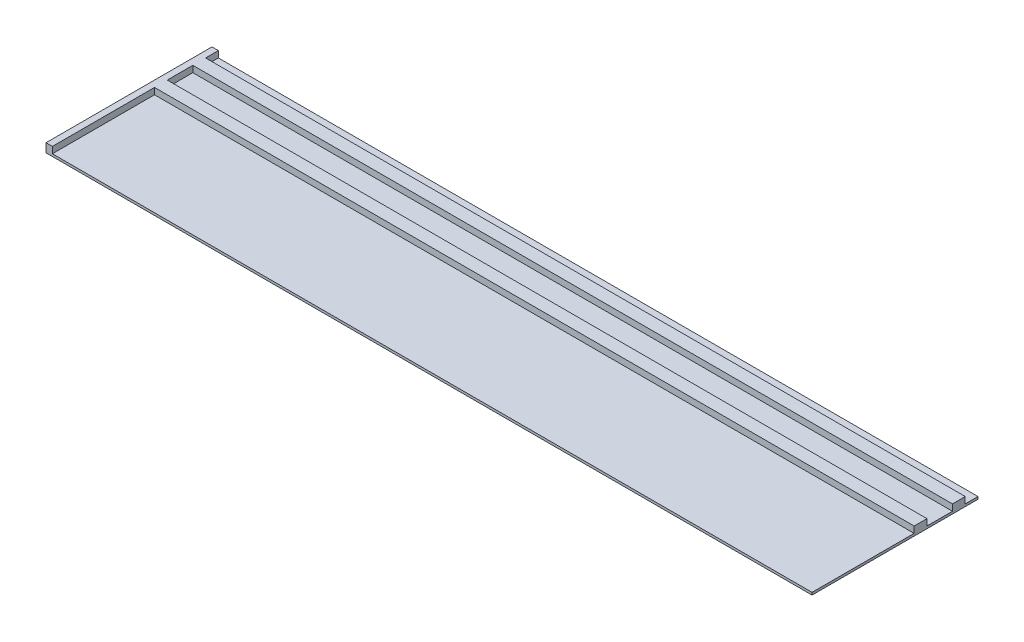
ISO-10303-21;
HEADER;
FILE_DESCRIPTION(('STEP AP214'),'2;1');
FILE_NAME('part.step','',(''),(''),'','','');
FILE_SCHEMA(('AUTOMOTIVE_DESIGN { 1 0 10303 214 1 1 1 1 }'));
ENDSEC;
DATA;
#1=APPLICATION_CONTEXT('core data for automotive mechanical design processes');
#2=APPLICATION_PROTOCOL_DEFINITION('international standard','automotive_design',2000,#1);
#3=PRODUCT_CONTEXT('',#1,'mechanical');
#4=PRODUCT('Part','Part','',(#3));
#5=PRODUCT_RELATED_PRODUCT_CATEGORY('part','',(#4));
#6=PRODUCT_DEFINITION_FORMATION('','',#4);
#7=PRODUCT_DEFINITION_CONTEXT('part definition',#1,'design');
#8=PRODUCT_DEFINITION('design','',#6,#7);
#9=PRODUCT_DEFINITION_SHAPE('','',#8);
#10=(LENGTH_UNIT() NAMED_UNIT(*) SI_UNIT(.MILLI.,.METRE.));
#11=(NAMED_UNIT(*) PLANE_ANGLE_UNIT() SI_UNIT($,.RADIAN.));
#12=(NAMED_UNIT(*) SI_UNIT($,.STERADIAN.) SOLID_ANGLE_UNIT());
#13=UNCERTAINTY_MEASURE_WITH_UNIT(LENGTH_MEASURE(1.E-05),#10,'distance_accuracy_value','');
#14=(GEOMETRIC_REPRESENTATION_CONTEXT(3) GLOBAL_UNCERTAINTY_ASSIGNED_CONTEXT((#13)) GLOBAL_UNIT_ASSIGNED_CONTEXT((#10,
#11,#12)) REPRESENTATION_CONTEXT('',''));
#15=CARTESIAN_POINT('',(0.,0.,0.));
#16=DIRECTION('',(0.,0.,1.));
#17=DIRECTION('',(1.,0.,0.));
#18=AXIS2_PLACEMENT_3D('',#15,#16,#17);
#19=CARTESIAN_POINT('',(0.,2.38125,0.));
#20=DIRECTION('',(0.,-1.,0.));
#21=DIRECTION('',(0.,0.,-1.));
#22=AXIS2_PLACEMENT_3D('',#19,#20,#21);
#23=PLANE('',#22);
#24=DIRECTION('',(0.,0.,-1.));
#25=VECTOR('',#24,1.);
#26=CARTESIAN_POINT('',(-374.65,2.38125,-82.55));
#27=LINE('',#26,#25);
#28=CARTESIAN_POINT('',(-374.65,2.38125,82.55));
#29=VERTEX_POINT('',#28);
#30=CARTESIAN_POINT('',(-374.65,2.38125,-19.05));
#31=VERTEX_POINT('',#30);
#32=EDGE_CURVE('E161',#29,#31,#27,.T.);
#33=ORIENTED_EDGE('',*,*,#32,.F.);
#34=DIRECTION('',(1.,0.,0.));
#35=VECTOR('',#34,1.);
#36=CARTESIAN_POINT('',(-381.,2.38125,82.55));
#37=LINE('',#36,#35);
#38=CARTESIAN_POINT('',(381.,2.38125,82.55));
#39=VERTEX_POINT('',#38);
#40=EDGE_CURVE('E239',#29,#39,#37,.T.);
#41=ORIENTED_EDGE('',*,*,#40,.T.);
#42=DIRECTION('',(0.,0.,-1.));
#43=VECTOR('',#42,1.);
#44=CARTESIAN_POINT('',(381.,2.38125,82.55));
#45=LINE('',#44,#43);
#46=CARTESIAN_POINT('',(381.,2.38125,-19.05));
#47=VERTEX_POINT('',#46);
#48=EDGE_CURVE('E231',#39,#47,#45,.T.);
#49=ORIENTED_EDGE('',*,*,#48,.T.);
#50=DIRECTION('',(1.,0.,0.));
#51=VECTOR('',#50,1.);
#52=CARTESIAN_POINT('',(-381.,2.38125,-19.05));
#53=LINE('',#52,#51);
#54=EDGE_CURVE('E37',#31,#47,#53,.T.);
#55=ORIENTED_EDGE('',*,*,#54,.F.);
#56=EDGE_LOOP('',(#33,#41,#49,#55));
#57=FACE_BOUND('',#56,.T.);
#58=ADVANCED_FACE('F33',(#57),#23,.F.);
#59=CARTESIAN_POINT('',(-374.65,2.38125,-69.85));
#60=VERTEX_POINT('',#59);
#61=CARTESIAN_POINT('',(-374.65,2.38125,-82.55));
#62=VERTEX_POINT('',#61);
#63=EDGE_CURVE('E165',#60,#62,#27,.T.);
#64=ORIENTED_EDGE('',*,*,#63,.F.);
#65=DIRECTION('',(-1.,0.,0.));
#66=VECTOR('',#65,1.);
#67=CARTESIAN_POINT('',(-381.,2.38125,-69.85));
#68=LINE('',#67,#66);
#69=CARTESIAN_POINT('',(381.,2.38125,-69.85));
#70=VERTEX_POINT('',#69);
#71=EDGE_CURVE('E195',#70,#60,#68,.T.);
#72=ORIENTED_EDGE('',*,*,#71,.F.);
#73=CARTESIAN_POINT('',(381.,2.38125,-82.55));
#74=VERTEX_POINT('',#73);
#75=EDGE_CURVE('E213',#70,#74,#45,.T.);
#76=ORIENTED_EDGE('',*,*,#75,.T.);
#77=DIRECTION('',(-1.,0.,0.));
#78=VECTOR('',#77,1.);
#79=CARTESIAN_POINT('',(-381.,2.38125,-82.55));
#80=LINE('',#79,#78);
#81=EDGE_CURVE('E241',#74,#62,#80,.T.);
#82=ORIENTED_EDGE('',*,*,#81,.T.);
#83=EDGE_LOOP('',(#64,#72,#76,#82));
#84=FACE_BOUND('',#83,.T.);
#85=ADVANCED_FACE('F277',(#84),#23,.F.);
#86=CARTESIAN_POINT('',(-381.,8.73125,-69.85));
#87=DIRECTION('',(0.,0.,1.));
#88=DIRECTION('',(1.,0.,0.));
#89=AXIS2_PLACEMENT_3D('',#86,#87,#88);
#90=PLANE('',#89);
#91=DIRECTION('',(0.,-1.,0.));
#92=VECTOR('',#91,1.);
#93=CARTESIAN_POINT('',(-374.65,8.73125,-69.85));
#94=LINE('',#93,#92);
#95=CARTESIAN_POINT('',(-374.65,8.73125,-69.85));
#96=VERTEX_POINT('',#95);
#97=EDGE_CURVE('E178',#96,#60,#94,.T.);
#98=ORIENTED_EDGE('',*,*,#97,.F.);
#99=DIRECTION('',(-1.,0.,0.));
#100=VECTOR('',#99,1.);
#101=CARTESIAN_POINT('',(-381.,8.73125,-69.85));
#102=LINE('',#101,#100);
#103=CARTESIAN_POINT('',(381.,8.73125,-69.85));
#104=VERTEX_POINT('',#103);
#105=EDGE_CURVE('E155',#104,#96,#102,.T.);
#106=ORIENTED_EDGE('',*,*,#105,.F.);
#107=DIRECTION('',(0.,-1.,0.));
#108=VECTOR('',#107,1.);
#109=CARTESIAN_POINT('',(381.,8.73125,-69.85));
#110=LINE('',#109,#108);
#111=EDGE_CURVE('E215',#104,#70,#110,.T.);
#112=ORIENTED_EDGE('',*,*,#111,.T.);
#113=ORIENTED_EDGE('',*,*,#71,.T.);
#114=EDGE_LOOP('',(#98,#106,#112,#113));
#115=FACE_BOUND('',#114,.T.);
#116=ADVANCED_FACE('F281',(#115),#90,.F.);
#117=CARTESIAN_POINT('',(-381.,8.73125,-19.05));
#118=DIRECTION('',(0.,0.,-1.));
#119=DIRECTION('',(-1.,0.,0.));
#120=AXIS2_PLACEMENT_3D('',#117,#118,#119);
#121=PLANE('',#120);
#122=DIRECTION('',(0.,1.,0.));
#123=VECTOR('',#122,1.);
#124=CARTESIAN_POINT('',(-374.65,8.73125,-19.05));
#125=LINE('',#124,#123);
#126=CARTESIAN_POINT('',(-374.65,8.73125,-19.05));
#127=VERTEX_POINT('',#126);
#128=EDGE_CURVE('E176',#31,#127,#125,.T.);
#129=ORIENTED_EDGE('',*,*,#128,.F.);
#130=ORIENTED_EDGE('',*,*,#54,.T.);
#131=DIRECTION('',(0.,-1.,0.));
#132=VECTOR('',#131,1.);
#133=CARTESIAN_POINT('',(381.,8.73125,-19.05));
#134=LINE('',#133,#132);
#135=CARTESIAN_POINT('',(381.,8.73125,-19.05));
#136=VERTEX_POINT('',#135);
#137=EDGE_CURVE('E205',#136,#47,#134,.T.);
#138=ORIENTED_EDGE('',*,*,#137,.F.);
#139=DIRECTION('',(1.,0.,0.));
#140=VECTOR('',#139,1.);
#141=CARTESIAN_POINT('',(-381.,8.73125,-19.05));
#142=LINE('',#141,#140);
#143=EDGE_CURVE('E154',#127,#136,#142,.T.);
#144=ORIENTED_EDGE('',*,*,#143,.F.);
#145=EDGE_LOOP('',(#129,#130,#138,#144));
#146=FACE_BOUND('',#145,.T.);
#147=ADVANCED_FACE('F235',(#146),#121,.F.);
#148=CARTESIAN_POINT('',(-381.,2.38125,-57.15));
#149=DIRECTION('',(0.,0.,-1.));
#150=DIRECTION('',(-1.,0.,0.));
#151=AXIS2_PLACEMENT_3D('',#148,#149,#150);
#152=PLANE('',#151);
#153=DIRECTION('',(0.,1.,0.));
#154=VECTOR('',#153,1.);
#155=CARTESIAN_POINT('',(-374.65,2.38125,-57.15));
#156=LINE('',#155,#154);
#157=CARTESIAN_POINT('',(-374.65,2.38125,-57.15));
#158=VERTEX_POINT('',#157);
#159=CARTESIAN_POINT('',(-374.65,8.73125,-57.15));
#160=VERTEX_POINT('',#159);
#161=EDGE_CURVE('E174',#158,#160,#156,.T.);
#162=ORIENTED_EDGE('',*,*,#161,.F.);
#163=DIRECTION('',(-1.,0.,0.));
#164=VECTOR('',#163,1.);
#165=CARTESIAN_POINT('',(-381.,2.38125,-57.15));
#166=LINE('',#165,#164);
#167=CARTESIAN_POINT('',(381.,2.38125,-57.15));
#168=VERTEX_POINT('',#167);
#169=EDGE_CURVE('E186',#168,#158,#166,.T.);
#170=ORIENTED_EDGE('',*,*,#169,.F.);
#171=DIRECTION('',(0.,1.,0.));
#172=VECTOR('',#171,1.);
#173=CARTESIAN_POINT('',(381.,2.38125,-57.15));
#174=LINE('',#173,#172);
#175=CARTESIAN_POINT('',(381.,8.73125,-57.15));
#176=VERTEX_POINT('',#175);
#177=EDGE_CURVE('E193',#168,#176,#174,.T.);
#178=ORIENTED_EDGE('',*,*,#177,.T.);
#179=DIRECTION('',(-1.,0.,0.));
#180=VECTOR('',#179,1.);
#181=CARTESIAN_POINT('',(-381.,8.73125,-57.15));
#182=LINE('',#181,#180);
#183=EDGE_CURVE('E184',#176,#160,#182,.T.);
#184=ORIENTED_EDGE('',*,*,#183,.T.);
#185=EDGE_LOOP('',(#162,#170,#178,#184));
#186=FACE_BOUND('',#185,.T.);
#187=ADVANCED_FACE('F288',(#186),#152,.F.);
#188=CARTESIAN_POINT('',(-381.,2.38125,-31.75));
#189=DIRECTION('',(0.,0.,1.));
#190=DIRECTION('',(1.,0.,0.));
#191=AXIS2_PLACEMENT_3D('',#188,#189,#190);
#192=PLANE('',#191);
#193=DIRECTION('',(0.,-1.,0.));
#194=VECTOR('',#193,1.);
#195=CARTESIAN_POINT('',(-374.65,2.38125,-31.75));
#196=LINE('',#195,#194);
#197=CARTESIAN_POINT('',(-374.65,8.73125,-31.75));
#198=VERTEX_POINT('',#197);
#199=CARTESIAN_POINT('',(-374.65,2.38125,-31.75));
#200=VERTEX_POINT('',#199);
#201=EDGE_CURVE('E58',#198,#200,#196,.T.);
#202=ORIENTED_EDGE('',*,*,#201,.F.);
#203=DIRECTION('',(1.,0.,0.));
#204=VECTOR('',#203,1.);
#205=CARTESIAN_POINT('',(-381.,8.73125,-31.75));
#206=LINE('',#205,#204);
#207=CARTESIAN_POINT('',(381.,8.73125,-31.75));
#208=VERTEX_POINT('',#207);
#209=EDGE_CURVE('E180',#198,#208,#206,.T.);
#210=ORIENTED_EDGE('',*,*,#209,.T.);
#211=DIRECTION('',(0.,1.,0.));
#212=VECTOR('',#211,1.);
#213=CARTESIAN_POINT('',(381.,2.38125,-31.75));
#214=LINE('',#213,#212);
#215=CARTESIAN_POINT('',(381.,2.38125,-31.75));
#216=VERTEX_POINT('',#215);
#217=EDGE_CURVE('E189',#216,#208,#214,.T.);
#218=ORIENTED_EDGE('',*,*,#217,.F.);
#219=DIRECTION('',(1.,0.,0.));
#220=VECTOR('',#219,1.);
#221=CARTESIAN_POINT('',(-381.,2.38125,-31.75));
#222=LINE('',#221,#220);
#223=EDGE_CURVE('E181',#200,#216,#222,.T.);
#224=ORIENTED_EDGE('',*,*,#223,.F.);
#225=EDGE_LOOP('',(#202,#210,#218,#224));
#226=FACE_BOUND('',#225,.T.);
#227=ADVANCED_FACE('F290',(#226),#192,.F.);
#228=CARTESIAN_POINT('',(0.,2.38125,0.));
#229=DIRECTION('',(0.,1.,0.));
#230=DIRECTION('',(0.,0.,1.));
#231=AXIS2_PLACEMENT_3D('',#228,#229,#230);
#232=PLANE('',#231);
#233=ORIENTED_EDGE('',*,*,#169,.T.);
#234=DIRECTION('',(0.,0.,1.));
#235=VECTOR('',#234,1.);
#236=CARTESIAN_POINT('',(-374.65,2.38125,0.));
#237=LINE('',#236,#235);
#238=EDGE_CURVE('E11',#158,#200,#237,.T.);
#239=ORIENTED_EDGE('',*,*,#238,.T.);
#240=ORIENTED_EDGE('',*,*,#223,.T.);
#241=DIRECTION('',(0.,0.,-1.));
#242=VECTOR('',#241,1.);
#243=CARTESIAN_POINT('',(381.,2.38125,-57.15));
#244=LINE('',#243,#242);
#245=EDGE_CURVE('E183',#216,#168,#244,.T.);
#246=ORIENTED_EDGE('',*,*,#245,.T.);
#247=EDGE_LOOP('',(#233,#239,#240,#246));
#248=FACE_BOUND('',#247,.T.);
#249=ADVANCED_FACE('F293',(#248),#232,.T.);
#250=CARTESIAN_POINT('',(381.,2.38125,82.55));
#251=DIRECTION('',(-1.,0.,0.));
#252=DIRECTION('',(0.,0.,1.));
#253=AXIS2_PLACEMENT_3D('',#250,#251,#252);
#254=PLANE('',#253);
#255=DIRECTION('',(0.,0.,-1.));
#256=VECTOR('',#255,1.);
#257=CARTESIAN_POINT('',(381.,8.73125,-19.05));
#258=LINE('',#257,#256);
#259=EDGE_CURVE('E201',#176,#104,#258,.T.);
#260=ORIENTED_EDGE('',*,*,#259,.F.);
#261=ORIENTED_EDGE('',*,*,#177,.F.);
#262=ORIENTED_EDGE('',*,*,#245,.F.);
#263=ORIENTED_EDGE('',*,*,#217,.T.);
#264=EDGE_CURVE('E198',#136,#208,#258,.T.);
#265=ORIENTED_EDGE('',*,*,#264,.F.);
#266=ORIENTED_EDGE('',*,*,#137,.T.);
#267=ORIENTED_EDGE('',*,*,#48,.F.);
#268=DIRECTION('',(0.,-1.,0.));
#269=VECTOR('',#268,1.);
#270=CARTESIAN_POINT('',(381.,2.38125,82.55));
#271=LINE('',#270,#269);
#272=CARTESIAN_POINT('',(381.,0.,82.55));
#273=VERTEX_POINT('',#272);
#274=EDGE_CURVE('E147',#39,#273,#271,.T.);
#275=ORIENTED_EDGE('',*,*,#274,.T.);
#276=DIRECTION('',(0.,0.,-1.));
#277=VECTOR('',#276,1.);
#278=CARTESIAN_POINT('',(381.,0.,82.55));
#279=LINE('',#278,#277);
#280=CARTESIAN_POINT('',(381.,0.,-82.55));
#281=VERTEX_POINT('',#280);
#282=EDGE_CURVE('E218',#273,#281,#279,.T.);
#283=ORIENTED_EDGE('',*,*,#282,.T.);
#284=DIRECTION('',(0.,-1.,0.));
#285=VECTOR('',#284,1.);
#286=CARTESIAN_POINT('',(381.,2.38125,-82.55));
#287=LINE('',#286,#285);
#288=EDGE_CURVE('E43',#74,#281,#287,.T.);
#289=ORIENTED_EDGE('',*,*,#288,.F.);
#290=ORIENTED_EDGE('',*,*,#75,.F.);
#291=ORIENTED_EDGE('',*,*,#111,.F.);
#292=EDGE_LOOP('',(#260,#261,#262,#263,#265,#266,#267,#275,#283,#289,#290,#291));
#293=FACE_BOUND('',#292,.T.);
#294=ADVANCED_FACE('F35',(#293),#254,.F.);
#295=CARTESIAN_POINT('',(-381.,2.38125,-82.55));
#296=DIRECTION('',(0.,0.,1.));
#297=DIRECTION('',(1.,0.,0.));
#298=AXIS2_PLACEMENT_3D('',#295,#296,#297);
#299=PLANE('',#298);
#300=DIRECTION('',(-1.,0.,0.));
#301=VECTOR('',#300,1.);
#302=CARTESIAN_POINT('',(-381.,0.,-82.55));
#303=LINE('',#302,#301);
#304=CARTESIAN_POINT('',(-381.,0.,-82.55));
#305=VERTEX_POINT('',#304);
#306=EDGE_CURVE('E253',#281,#305,#303,.T.);
#307=ORIENTED_EDGE('',*,*,#306,.T.);
#308=DIRECTION('',(0.,-1.,0.));
#309=VECTOR('',#308,1.);
#310=CARTESIAN_POINT('',(-381.,2.38125,-82.55));
#311=LINE('',#310,#309);
#312=CARTESIAN_POINT('',(-381.,8.73125,-82.55));
#313=VERTEX_POINT('',#312);
#314=EDGE_CURVE('E146',#313,#305,#311,.T.);
#315=ORIENTED_EDGE('',*,*,#314,.F.);
#316=DIRECTION('',(-1.,0.,0.));
#317=VECTOR('',#316,1.);
#318=CARTESIAN_POINT('',(-381.,8.73125,-82.55));
#319=LINE('',#318,#317);
#320=CARTESIAN_POINT('',(-374.65,8.73125,-82.55));
#321=VERTEX_POINT('',#320);
#322=EDGE_CURVE('E153',#321,#313,#319,.T.);
#323=ORIENTED_EDGE('',*,*,#322,.F.);
#324=DIRECTION('',(0.,-1.,0.));
#325=VECTOR('',#324,1.);
#326=CARTESIAN_POINT('',(-374.65,8.73125,-82.55));
#327=LINE('',#326,#325);
#328=EDGE_CURVE('E168',#321,#62,#327,.T.);
#329=ORIENTED_EDGE('',*,*,#328,.T.);
#330=ORIENTED_EDGE('',*,*,#81,.F.);
#331=ORIENTED_EDGE('',*,*,#288,.T.);
#332=EDGE_LOOP('',(#307,#315,#323,#329,#330,#331));
#333=FACE_BOUND('',#332,.T.);
#334=ADVANCED_FACE('F261',(#333),#299,.F.);
#335=CARTESIAN_POINT('',(-381.,2.38125,82.55));
#336=DIRECTION('',(1.,0.,0.));
#337=DIRECTION('',(0.,0.,-1.));
#338=AXIS2_PLACEMENT_3D('',#335,#336,#337);
#339=PLANE('',#338);
#340=DIRECTION('',(0.,-1.,0.));
#341=VECTOR('',#340,1.);
#342=CARTESIAN_POINT('',(-381.,2.38125,82.55));
#343=LINE('',#342,#341);
#344=CARTESIAN_POINT('',(-381.,8.73125,82.55));
#345=VERTEX_POINT('',#344);
#346=CARTESIAN_POINT('',(-381.,0.,82.55));
#347=VERTEX_POINT('',#346);
#348=EDGE_CURVE('E135',#345,#347,#343,.T.);
#349=ORIENTED_EDGE('',*,*,#348,.F.);
#350=DIRECTION('',(0.,0.,1.));
#351=VECTOR('',#350,1.);
#352=CARTESIAN_POINT('',(-381.,8.73125,-19.05));
#353=LINE('',#352,#351);
#354=EDGE_CURVE('E139',#313,#345,#353,.T.);
#355=ORIENTED_EDGE('',*,*,#354,.F.);
#356=ORIENTED_EDGE('',*,*,#314,.T.);
#357=DIRECTION('',(0.,0.,1.));
#358=VECTOR('',#357,1.);
#359=CARTESIAN_POINT('',(-381.,0.,82.55));
#360=LINE('',#359,#358);
#361=EDGE_CURVE('E142',#305,#347,#360,.T.);
#362=ORIENTED_EDGE('',*,*,#361,.T.);
#363=EDGE_LOOP('',(#349,#355,#356,#362));
#364=FACE_BOUND('',#363,.T.);
#365=ADVANCED_FACE('F137',(#364),#339,.F.);
#366=CARTESIAN_POINT('',(-381.,2.38125,82.55));
#367=DIRECTION('',(0.,0.,-1.));
#368=DIRECTION('',(-1.,0.,0.));
#369=AXIS2_PLACEMENT_3D('',#366,#367,#368);
#370=PLANE('',#369);
#371=DIRECTION('',(1.,0.,0.));
#372=VECTOR('',#371,1.);
#373=CARTESIAN_POINT('',(-381.,0.,82.55));
#374=LINE('',#373,#372);
#375=EDGE_CURVE('E244',#347,#273,#374,.T.);
#376=ORIENTED_EDGE('',*,*,#375,.T.);
#377=ORIENTED_EDGE('',*,*,#274,.F.);
#378=ORIENTED_EDGE('',*,*,#40,.F.);
#379=DIRECTION('',(0.,-1.,0.));
#380=VECTOR('',#379,1.);
#381=CARTESIAN_POINT('',(-374.65,8.73125,82.55));
#382=LINE('',#381,#380);
#383=CARTESIAN_POINT('',(-374.65,8.73125,82.55));
#384=VERTEX_POINT('',#383);
#385=EDGE_CURVE('E159',#384,#29,#382,.T.);
#386=ORIENTED_EDGE('',*,*,#385,.F.);
#387=DIRECTION('',(1.,0.,0.));
#388=VECTOR('',#387,1.);
#389=CARTESIAN_POINT('',(-381.,8.73125,82.55));
#390=LINE('',#389,#388);
#391=EDGE_CURVE('E150',#345,#384,#390,.T.);
#392=ORIENTED_EDGE('',*,*,#391,.F.);
#393=ORIENTED_EDGE('',*,*,#348,.T.);
#394=EDGE_LOOP('',(#376,#377,#378,#386,#392,#393));
#395=FACE_BOUND('',#394,.T.);
#396=ADVANCED_FACE('F157',(#395),#370,.F.);
#397=CARTESIAN_POINT('',(0.,0.,0.));
#398=DIRECTION('',(0.,-1.,0.));
#399=DIRECTION('',(0.,0.,-1.));
#400=AXIS2_PLACEMENT_3D('',#397,#398,#399);
#401=PLANE('',#400);
#402=ORIENTED_EDGE('',*,*,#282,.F.);
#403=ORIENTED_EDGE('',*,*,#375,.F.);
#404=ORIENTED_EDGE('',*,*,#361,.F.);
#405=ORIENTED_EDGE('',*,*,#306,.F.);
#406=EDGE_LOOP('',(#402,#403,#404,#405));
#407=FACE_BOUND('',#406,.T.);
#408=ADVANCED_FACE('F265',(#407),#401,.T.);
#409=CARTESIAN_POINT('',(0.,8.73125,0.));
#410=DIRECTION('',(0.,-1.,0.));
#411=DIRECTION('',(0.,0.,-1.));
#412=AXIS2_PLACEMENT_3D('',#409,#410,#411);
#413=PLANE('',#412);
#414=ORIENTED_EDGE('',*,*,#354,.T.);
#415=ORIENTED_EDGE('',*,*,#391,.T.);
#416=DIRECTION('',(0.,0.,-1.));
#417=VECTOR('',#416,1.);
#418=CARTESIAN_POINT('',(-374.65,8.73125,-82.55));
#419=LINE('',#418,#417);
#420=EDGE_CURVE('E50',#384,#127,#419,.T.);
#421=ORIENTED_EDGE('',*,*,#420,.T.);
#422=ORIENTED_EDGE('',*,*,#143,.T.);
#423=ORIENTED_EDGE('',*,*,#264,.T.);
#424=ORIENTED_EDGE('',*,*,#209,.F.);
#425=EDGE_CURVE('E163',#198,#160,#419,.T.);
#426=ORIENTED_EDGE('',*,*,#425,.T.);
#427=ORIENTED_EDGE('',*,*,#183,.F.);
#428=ORIENTED_EDGE('',*,*,#259,.T.);
#429=ORIENTED_EDGE('',*,*,#105,.T.);
#430=EDGE_CURVE('E160',#96,#321,#419,.T.);
#431=ORIENTED_EDGE('',*,*,#430,.T.);
#432=ORIENTED_EDGE('',*,*,#322,.T.);
#433=EDGE_LOOP('',(#414,#415,#421,#422,#423,#424,#426,#427,#428,#429,#431,#432));
#434=FACE_BOUND('',#433,.T.);
#435=ADVANCED_FACE('F149',(#434),#413,.F.);
#436=CARTESIAN_POINT('',(-374.65,8.73125,-82.55));
#437=DIRECTION('',(-1.,0.,0.));
#438=DIRECTION('',(0.,0.,1.));
#439=AXIS2_PLACEMENT_3D('',#436,#437,#438);
#440=PLANE('',#439);
#441=ORIENTED_EDGE('',*,*,#238,.F.);
#442=ORIENTED_EDGE('',*,*,#161,.T.);
#443=ORIENTED_EDGE('',*,*,#425,.F.);
#444=ORIENTED_EDGE('',*,*,#201,.T.);
#445=EDGE_LOOP('',(#441,#442,#443,#444));
#446=FACE_BOUND('',#445,.T.);
#447=ADVANCED_FACE('F272',(#446),#440,.F.);
#448=ORIENTED_EDGE('',*,*,#32,.T.);
#449=ORIENTED_EDGE('',*,*,#128,.T.);
#450=ORIENTED_EDGE('',*,*,#420,.F.);
#451=ORIENTED_EDGE('',*,*,#385,.T.);
#452=EDGE_LOOP('',(#448,#449,#450,#451));
#453=FACE_BOUND('',#452,.T.);
#454=ADVANCED_FACE('F303',(#453),#440,.F.);
#455=ORIENTED_EDGE('',*,*,#430,.F.);
#456=ORIENTED_EDGE('',*,*,#97,.T.);
#457=ORIENTED_EDGE('',*,*,#63,.T.);
#458=ORIENTED_EDGE('',*,*,#328,.F.);
#459=EDGE_LOOP('',(#455,#456,#457,#458));
#460=FACE_BOUND('',#459,.T.);
#461=ADVANCED_FACE('F301',(#460),#440,.F.);
#462=CLOSED_SHELL('',(#58,#85,#116,#147,#187,#227,#249,#294,#334,#365,#396,#408,#435,#447,#454,#461));
#463=MANIFOLD_SOLID_BREP('B2',#462);
#464=ADVANCED_BREP_SHAPE_REPRESENTATION('',(#18,#463),#14);
#465=SHAPE_DEFINITION_REPRESENTATION(#9,#464);
ENDSEC;
END-ISO-10303-21;
